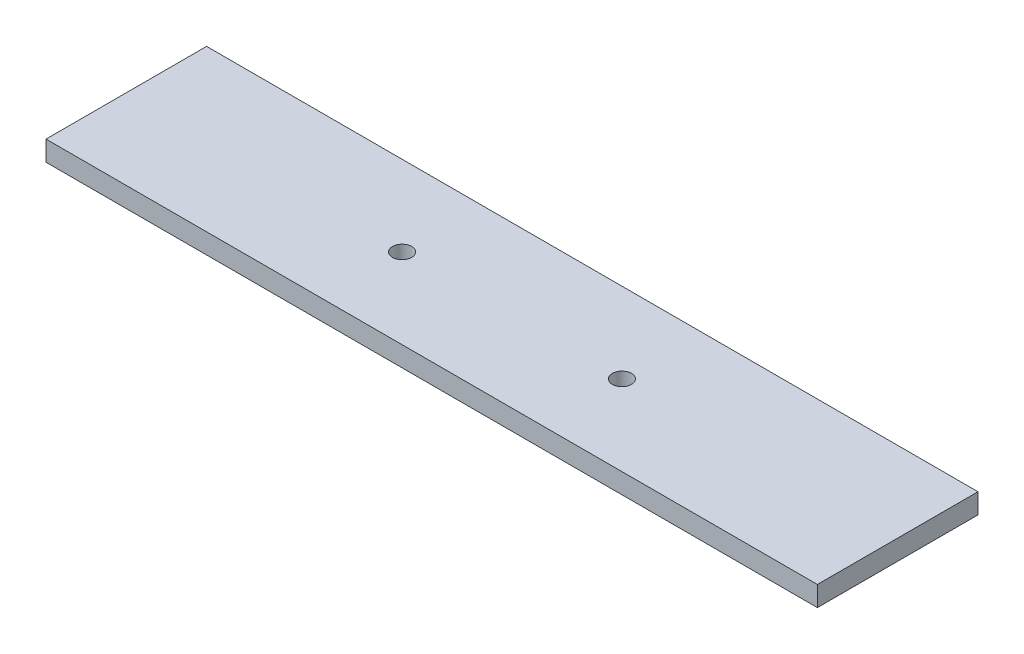
ISO-10303-21;
HEADER;
FILE_DESCRIPTION(('STEP AP214'),'2;1');
FILE_NAME('part.step','',(''),(''),'','','');
FILE_SCHEMA(('AUTOMOTIVE_DESIGN { 1 0 10303 214 1 1 1 1 }'));
ENDSEC;
DATA;
#1=APPLICATION_CONTEXT('core data for automotive mechanical design processes');
#2=APPLICATION_PROTOCOL_DEFINITION('international standard','automotive_design',2000,#1);
#3=PRODUCT_CONTEXT('',#1,'mechanical');
#4=PRODUCT('Part','Part','',(#3));
#5=PRODUCT_RELATED_PRODUCT_CATEGORY('part','',(#4));
#6=PRODUCT_DEFINITION_FORMATION('','',#4);
#7=PRODUCT_DEFINITION_CONTEXT('part definition',#1,'design');
#8=PRODUCT_DEFINITION('design','',#6,#7);
#9=PRODUCT_DEFINITION_SHAPE('','',#8);
#10=(LENGTH_UNIT() NAMED_UNIT(*) SI_UNIT(.MILLI.,.METRE.));
#11=(NAMED_UNIT(*) PLANE_ANGLE_UNIT() SI_UNIT($,.RADIAN.));
#12=(NAMED_UNIT(*) SI_UNIT($,.STERADIAN.) SOLID_ANGLE_UNIT());
#13=UNCERTAINTY_MEASURE_WITH_UNIT(LENGTH_MEASURE(1.E-05),#10,'distance_accuracy_value','');
#14=(GEOMETRIC_REPRESENTATION_CONTEXT(3) GLOBAL_UNCERTAINTY_ASSIGNED_CONTEXT((#13)) GLOBAL_UNIT_ASSIGNED_CONTEXT((#10,
#11,#12)) REPRESENTATION_CONTEXT('',''));
#15=CARTESIAN_POINT('',(0.,0.,0.));
#16=DIRECTION('',(0.,0.,1.));
#17=DIRECTION('',(1.,0.,0.));
#18=AXIS2_PLACEMENT_3D('',#15,#16,#17);
#19=CARTESIAN_POINT('',(-122.,6.35,-25.4));
#20=DIRECTION('',(1.,0.,0.));
#21=DIRECTION('',(0.,0.,-1.));
#22=AXIS2_PLACEMENT_3D('',#19,#20,#21);
#23=PLANE('',#22);
#24=DIRECTION('',(0.,0.,1.));
#25=VECTOR('',#24,1.);
#26=CARTESIAN_POINT('',(-122.,0.,-25.4));
#27=LINE('',#26,#25);
#28=CARTESIAN_POINT('',(-122.,0.,-25.4));
#29=VERTEX_POINT('',#28);
#30=CARTESIAN_POINT('',(-122.,0.,25.4));
#31=VERTEX_POINT('',#30);
#32=EDGE_CURVE('E106',#29,#31,#27,.T.);
#33=ORIENTED_EDGE('',*,*,#32,.T.);
#34=DIRECTION('',(0.,-1.,0.));
#35=VECTOR('',#34,1.);
#36=CARTESIAN_POINT('',(-122.,6.35,25.4));
#37=LINE('',#36,#35);
#38=CARTESIAN_POINT('',(-122.,6.35,25.4));
#39=VERTEX_POINT('',#38);
#40=EDGE_CURVE('E11',#39,#31,#37,.T.);
#41=ORIENTED_EDGE('',*,*,#40,.F.);
#42=DIRECTION('',(0.,0.,1.));
#43=VECTOR('',#42,1.);
#44=CARTESIAN_POINT('',(-122.,6.35,-25.4));
#45=LINE('',#44,#43);
#46=CARTESIAN_POINT('',(-122.,6.35,-25.4));
#47=VERTEX_POINT('',#46);
#48=EDGE_CURVE('E94',#47,#39,#45,.T.);
#49=ORIENTED_EDGE('',*,*,#48,.F.);
#50=DIRECTION('',(0.,-1.,0.));
#51=VECTOR('',#50,1.);
#52=CARTESIAN_POINT('',(-122.,6.35,-25.4));
#53=LINE('',#52,#51);
#54=EDGE_CURVE('E102',#47,#29,#53,.T.);
#55=ORIENTED_EDGE('',*,*,#54,.T.);
#56=EDGE_LOOP('',(#33,#41,#49,#55));
#57=FACE_BOUND('',#56,.T.);
#58=ADVANCED_FACE('F43',(#57),#23,.F.);
#59=CARTESIAN_POINT('',(122.,6.35,25.4));
#60=DIRECTION('',(0.,0.,-1.));
#61=DIRECTION('',(-1.,0.,0.));
#62=AXIS2_PLACEMENT_3D('',#59,#60,#61);
#63=PLANE('',#62);
#64=DIRECTION('',(1.,0.,0.));
#65=VECTOR('',#64,1.);
#66=CARTESIAN_POINT('',(122.,0.,25.4));
#67=LINE('',#66,#65);
#68=CARTESIAN_POINT('',(122.,0.,25.4));
#69=VERTEX_POINT('',#68);
#70=EDGE_CURVE('E98',#31,#69,#67,.T.);
#71=ORIENTED_EDGE('',*,*,#70,.T.);
#72=DIRECTION('',(0.,-1.,0.));
#73=VECTOR('',#72,1.);
#74=CARTESIAN_POINT('',(122.,6.35,25.4));
#75=LINE('',#74,#73);
#76=CARTESIAN_POINT('',(122.,6.35,25.4));
#77=VERTEX_POINT('',#76);
#78=EDGE_CURVE('E51',#77,#69,#75,.T.);
#79=ORIENTED_EDGE('',*,*,#78,.F.);
#80=DIRECTION('',(1.,0.,0.));
#81=VECTOR('',#80,1.);
#82=CARTESIAN_POINT('',(122.,6.35,25.4));
#83=LINE('',#82,#81);
#84=EDGE_CURVE('E89',#39,#77,#83,.T.);
#85=ORIENTED_EDGE('',*,*,#84,.F.);
#86=ORIENTED_EDGE('',*,*,#40,.T.);
#87=EDGE_LOOP('',(#71,#79,#85,#86));
#88=FACE_BOUND('',#87,.T.);
#89=ADVANCED_FACE('F97',(#88),#63,.F.);
#90=CARTESIAN_POINT('',(122.,6.35,-25.4));
#91=DIRECTION('',(-1.,0.,0.));
#92=DIRECTION('',(0.,0.,1.));
#93=AXIS2_PLACEMENT_3D('',#90,#91,#92);
#94=PLANE('',#93);
#95=DIRECTION('',(0.,0.,-1.));
#96=VECTOR('',#95,1.);
#97=CARTESIAN_POINT('',(122.,0.,-25.4));
#98=LINE('',#97,#96);
#99=CARTESIAN_POINT('',(122.,0.,-25.4));
#100=VERTEX_POINT('',#99);
#101=EDGE_CURVE('E76',#69,#100,#98,.T.);
#102=ORIENTED_EDGE('',*,*,#101,.T.);
#103=DIRECTION('',(0.,-1.,0.));
#104=VECTOR('',#103,1.);
#105=CARTESIAN_POINT('',(122.,6.35,-25.4));
#106=LINE('',#105,#104);
#107=CARTESIAN_POINT('',(122.,6.35,-25.4));
#108=VERTEX_POINT('',#107);
#109=EDGE_CURVE('E99',#108,#100,#106,.T.);
#110=ORIENTED_EDGE('',*,*,#109,.F.);
#111=DIRECTION('',(0.,0.,-1.));
#112=VECTOR('',#111,1.);
#113=CARTESIAN_POINT('',(122.,6.35,-25.4));
#114=LINE('',#113,#112);
#115=EDGE_CURVE('E92',#77,#108,#114,.T.);
#116=ORIENTED_EDGE('',*,*,#115,.F.);
#117=ORIENTED_EDGE('',*,*,#78,.T.);
#118=EDGE_LOOP('',(#102,#110,#116,#117));
#119=FACE_BOUND('',#118,.T.);
#120=ADVANCED_FACE('F100',(#119),#94,.F.);
#121=CARTESIAN_POINT('',(122.,6.35,-25.4));
#122=DIRECTION('',(0.,0.,1.));
#123=DIRECTION('',(1.,0.,0.));
#124=AXIS2_PLACEMENT_3D('',#121,#122,#123);
#125=PLANE('',#124);
#126=DIRECTION('',(-1.,0.,0.));
#127=VECTOR('',#126,1.);
#128=CARTESIAN_POINT('',(122.,0.,-25.4));
#129=LINE('',#128,#127);
#130=EDGE_CURVE('E82',#100,#29,#129,.T.);
#131=ORIENTED_EDGE('',*,*,#130,.T.);
#132=ORIENTED_EDGE('',*,*,#54,.F.);
#133=DIRECTION('',(-1.,0.,0.));
#134=VECTOR('',#133,1.);
#135=CARTESIAN_POINT('',(122.,6.35,-25.4));
#136=LINE('',#135,#134);
#137=EDGE_CURVE('E59',#108,#47,#136,.T.);
#138=ORIENTED_EDGE('',*,*,#137,.F.);
#139=ORIENTED_EDGE('',*,*,#109,.T.);
#140=EDGE_LOOP('',(#131,#132,#138,#139));
#141=FACE_BOUND('',#140,.T.);
#142=ADVANCED_FACE('F114',(#141),#125,.F.);
#143=CARTESIAN_POINT('',(0.,6.35,0.));
#144=DIRECTION('',(0.,-1.,0.));
#145=DIRECTION('',(0.,0.,-1.));
#146=AXIS2_PLACEMENT_3D('',#143,#144,#145);
#147=PLANE('',#146);
#148=CARTESIAN_POINT('',(-34.7726,6.35,0.));
#149=DIRECTION('',(0.,1.,0.));
#150=DIRECTION('',(0.,0.,1.));
#151=AXIS2_PLACEMENT_3D('',#148,#149,#150);
#152=CIRCLE('',#151,3.0226);
#153=CARTESIAN_POINT('',(-34.7726,6.35,3.0226));
#154=VERTEX_POINT('',#153);
#155=EDGE_CURVE('E126',#154,#154,#152,.T.);
#156=ORIENTED_EDGE('',*,*,#155,.F.);
#157=EDGE_LOOP('',(#156));
#158=FACE_BOUND('',#157,.T.);
#159=CARTESIAN_POINT('',(34.7726,6.35,0.));
#160=DIRECTION('',(0.,1.,0.));
#161=DIRECTION('',(0.,0.,-1.));
#162=AXIS2_PLACEMENT_3D('',#159,#160,#161);
#163=CIRCLE('',#162,3.0226);
#164=CARTESIAN_POINT('',(34.7726,6.35,-3.0226));
#165=VERTEX_POINT('',#164);
#166=EDGE_CURVE('E123',#165,#165,#163,.T.);
#167=ORIENTED_EDGE('',*,*,#166,.F.);
#168=EDGE_LOOP('',(#167));
#169=FACE_BOUND('',#168,.T.);
#170=ORIENTED_EDGE('',*,*,#48,.T.);
#171=ORIENTED_EDGE('',*,*,#84,.T.);
#172=ORIENTED_EDGE('',*,*,#115,.T.);
#173=ORIENTED_EDGE('',*,*,#137,.T.);
#174=EDGE_LOOP('',(#170,#171,#172,#173));
#175=FACE_BOUND('',#174,.T.);
#176=ADVANCED_FACE('F90',(#158,#169,#175),#147,.F.);
#177=CARTESIAN_POINT('',(0.,0.,0.));
#178=DIRECTION('',(0.,-1.,0.));
#179=DIRECTION('',(0.,0.,-1.));
#180=AXIS2_PLACEMENT_3D('',#177,#178,#179);
#181=PLANE('',#180);
#182=CARTESIAN_POINT('',(-34.7726,0.,0.));
#183=DIRECTION('',(0.,1.,0.));
#184=DIRECTION('',(0.,0.,1.));
#185=AXIS2_PLACEMENT_3D('',#182,#183,#184);
#186=CIRCLE('',#185,3.0226);
#187=CARTESIAN_POINT('',(-34.7726,0.,3.0226));
#188=VERTEX_POINT('',#187);
#189=EDGE_CURVE('E109',#188,#188,#186,.T.);
#190=ORIENTED_EDGE('',*,*,#189,.T.);
#191=EDGE_LOOP('',(#190));
#192=FACE_BOUND('',#191,.T.);
#193=CARTESIAN_POINT('',(34.7726,0.,0.));
#194=DIRECTION('',(0.,1.,0.));
#195=DIRECTION('',(0.,0.,-1.));
#196=AXIS2_PLACEMENT_3D('',#193,#194,#195);
#197=CIRCLE('',#196,3.0226);
#198=CARTESIAN_POINT('',(34.7726,0.,-3.0226));
#199=VERTEX_POINT('',#198);
#200=EDGE_CURVE('E120',#199,#199,#197,.T.);
#201=ORIENTED_EDGE('',*,*,#200,.T.);
#202=EDGE_LOOP('',(#201));
#203=FACE_BOUND('',#202,.T.);
#204=ORIENTED_EDGE('',*,*,#32,.F.);
#205=ORIENTED_EDGE('',*,*,#130,.F.);
#206=ORIENTED_EDGE('',*,*,#101,.F.);
#207=ORIENTED_EDGE('',*,*,#70,.F.);
#208=EDGE_LOOP('',(#204,#205,#206,#207));
#209=FACE_BOUND('',#208,.T.);
#210=ADVANCED_FACE('F117',(#192,#203,#209),#181,.T.);
#211=CARTESIAN_POINT('',(34.7726,0.,0.));
#212=DIRECTION('',(0.,1.,0.));
#213=DIRECTION('',(0.,0.,1.));
#214=AXIS2_PLACEMENT_3D('',#211,#212,#213);
#215=CYLINDRICAL_SURFACE('',#214,3.0226);
#216=ORIENTED_EDGE('',*,*,#200,.F.);
#217=EDGE_LOOP('',(#216));
#218=FACE_BOUND('',#217,.T.);
#219=ORIENTED_EDGE('',*,*,#166,.T.);
#220=EDGE_LOOP('',(#219));
#221=FACE_BOUND('',#220,.T.);
#222=ADVANCED_FACE('F137',(#218,#221),#215,.F.);
#223=CARTESIAN_POINT('',(-34.7726,0.,0.));
#224=DIRECTION('',(0.,1.,0.));
#225=DIRECTION('',(0.,0.,1.));
#226=AXIS2_PLACEMENT_3D('',#223,#224,#225);
#227=CYLINDRICAL_SURFACE('',#226,3.0226);
#228=ORIENTED_EDGE('',*,*,#189,.F.);
#229=EDGE_LOOP('',(#228));
#230=FACE_BOUND('',#229,.T.);
#231=ORIENTED_EDGE('',*,*,#155,.T.);
#232=EDGE_LOOP('',(#231));
#233=FACE_BOUND('',#232,.T.);
#234=ADVANCED_FACE('F134',(#230,#233),#227,.F.);
#235=CLOSED_SHELL('',(#58,#89,#120,#142,#176,#210,#222,#234));
#236=MANIFOLD_SOLID_BREP('B2',#235);
#237=ADVANCED_BREP_SHAPE_REPRESENTATION('',(#18,#236),#14);
#238=SHAPE_DEFINITION_REPRESENTATION(#9,#237);
ENDSEC;
END-ISO-10303-21;
